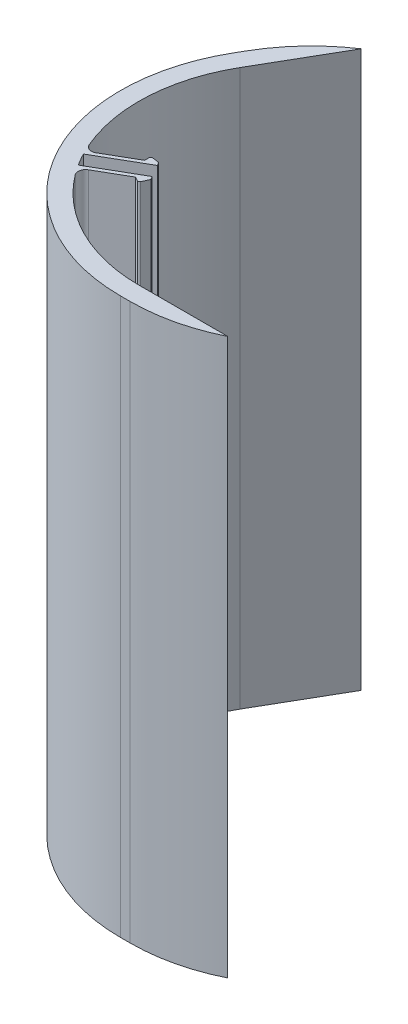
ISO-10303-21;
HEADER;
FILE_DESCRIPTION(('STEP AP214'),'2;1');
FILE_NAME('part.step','',(''),(''),'','','');
FILE_SCHEMA(('AUTOMOTIVE_DESIGN { 1 0 10303 214 1 1 1 1 }'));
ENDSEC;
DATA;
#1=APPLICATION_CONTEXT('core data for automotive mechanical design processes');
#2=APPLICATION_PROTOCOL_DEFINITION('international standard','automotive_design',2000,#1);
#3=PRODUCT_CONTEXT('',#1,'mechanical');
#4=PRODUCT('Part','Part','',(#3));
#5=PRODUCT_RELATED_PRODUCT_CATEGORY('part','',(#4));
#6=PRODUCT_DEFINITION_FORMATION('','',#4);
#7=PRODUCT_DEFINITION_CONTEXT('part definition',#1,'design');
#8=PRODUCT_DEFINITION('design','',#6,#7);
#9=PRODUCT_DEFINITION_SHAPE('','',#8);
#10=(LENGTH_UNIT() NAMED_UNIT(*) SI_UNIT(.MILLI.,.METRE.));
#11=(NAMED_UNIT(*) PLANE_ANGLE_UNIT() SI_UNIT($,.RADIAN.));
#12=(NAMED_UNIT(*) SI_UNIT($,.STERADIAN.) SOLID_ANGLE_UNIT());
#13=UNCERTAINTY_MEASURE_WITH_UNIT(LENGTH_MEASURE(1.E-05),#10,'distance_accuracy_value','');
#14=(GEOMETRIC_REPRESENTATION_CONTEXT(3) GLOBAL_UNCERTAINTY_ASSIGNED_CONTEXT((#13)) GLOBAL_UNIT_ASSIGNED_CONTEXT((#10,
#11,#12)) REPRESENTATION_CONTEXT('',''));
#15=CARTESIAN_POINT('',(0.,0.,0.));
#16=DIRECTION('',(0.,0.,1.));
#17=DIRECTION('',(1.,0.,0.));
#18=AXIS2_PLACEMENT_3D('',#15,#16,#17);
#19=CARTESIAN_POINT('',(83.1384387633066,150.,-48.));
#20=DIRECTION('',(0.,-1.,0.));
#21=DIRECTION('',(0.,0.,-1.));
#22=AXIS2_PLACEMENT_3D('',#19,#20,#21);
#23=CYLINDRICAL_SURFACE('',#22,43.);
#24=DIRECTION('',(0.,-1.,0.));
#25=VECTOR('',#24,1.);
#26=CARTESIAN_POINT('',(46.885717088677,150.,-24.8755503593741));
#27=LINE('',#26,#25);
#28=CARTESIAN_POINT('',(46.885717088677,0.,-24.875550359374));
#29=VERTEX_POINT('',#28);
#30=CARTESIAN_POINT('',(46.885717088677,150.,-24.875550359374));
#31=VERTEX_POINT('',#30);
#32=EDGE_CURVE('E230',#29,#31,#27,.F.);
#33=ORIENTED_EDGE('',*,*,#32,.F.);
#34=CARTESIAN_POINT('',(83.1384387633066,0.,-48.));
#35=DIRECTION('',(0.,-1.,0.));
#36=DIRECTION('',(0.,0.,-1.));
#37=AXIS2_PLACEMENT_3D('',#34,#35,#36);
#38=CIRCLE('',#37,43.);
#39=CARTESIAN_POINT('',(44.9857170886769,0.,-28.1664468937549));
#40=VERTEX_POINT('',#39);
#41=EDGE_CURVE('E321',#29,#40,#38,.T.);
#42=ORIENTED_EDGE('',*,*,#41,.T.);
#43=DIRECTION('',(0.,-1.,0.));
#44=VECTOR('',#43,1.);
#45=CARTESIAN_POINT('',(44.9857170886769,150.,-28.1664468937549));
#46=LINE('',#45,#44);
#47=CARTESIAN_POINT('',(44.9857170886769,150.,-28.1664468937549));
#48=VERTEX_POINT('',#47);
#49=EDGE_CURVE('E334',#48,#40,#46,.T.);
#50=ORIENTED_EDGE('',*,*,#49,.F.);
#51=CARTESIAN_POINT('',(83.1384387633066,150.,-48.));
#52=DIRECTION('',(0.,-1.,0.));
#53=DIRECTION('',(0.,0.,-1.));
#54=AXIS2_PLACEMENT_3D('',#51,#52,#53);
#55=CIRCLE('',#54,43.);
#56=EDGE_CURVE('E282',#31,#48,#55,.T.);
#57=ORIENTED_EDGE('',*,*,#56,.F.);
#58=EDGE_LOOP('',(#33,#42,#50,#57));
#59=FACE_BOUND('',#58,.T.);
#60=ADVANCED_FACE('F32',(#59),#23,.F.);
#61=CARTESIAN_POINT('',(83.1384387633084,0.,-5.00000000000001));
#62=VERTEX_POINT('',#61);
#63=CARTESIAN_POINT('',(48.7357611228602,0.,-22.2035705732841));
#64=VERTEX_POINT('',#63);
#65=EDGE_CURVE('E318',#62,#64,#38,.T.);
#66=ORIENTED_EDGE('',*,*,#65,.T.);
#67=DIRECTION('',(0.,-1.,0.));
#68=VECTOR('',#67,1.);
#69=CARTESIAN_POINT('',(48.7357611228602,150.,-22.2035705732841));
#70=LINE('',#69,#68);
#71=CARTESIAN_POINT('',(48.7357611228602,150.,-22.2035705732841));
#72=VERTEX_POINT('',#71);
#73=EDGE_CURVE('E338',#64,#72,#70,.F.);
#74=ORIENTED_EDGE('',*,*,#73,.T.);
#75=CARTESIAN_POINT('',(83.1384387633066,150.,-5.00000000000001));
#76=VERTEX_POINT('',#75);
#77=EDGE_CURVE('E278',#76,#72,#55,.T.);
#78=ORIENTED_EDGE('',*,*,#77,.F.);
#79=DIRECTION('',(0.,-1.,0.));
#80=VECTOR('',#79,1.);
#81=CARTESIAN_POINT('',(83.1384387633066,150.,-5.00000000000001));
#82=LINE('',#81,#80);
#83=EDGE_CURVE('E284',#76,#62,#82,.T.);
#84=ORIENTED_EDGE('',*,*,#83,.T.);
#85=EDGE_LOOP('',(#66,#74,#78,#84));
#86=FACE_BOUND('',#85,.T.);
#87=ADVANCED_FACE('F388',(#86),#23,.F.);
#88=CARTESIAN_POINT('',(43.596736732616,150.,-31.1046219185221));
#89=VERTEX_POINT('',#88);
#90=CARTESIAN_POINT('',(45.8993464005758,150.,-69.5000000000002));
#91=VERTEX_POINT('',#90);
#92=EDGE_CURVE('E277',#89,#91,#55,.T.);
#93=ORIENTED_EDGE('',*,*,#92,.F.);
#94=DIRECTION('',(0.,-1.,0.));
#95=VECTOR('',#94,1.);
#96=CARTESIAN_POINT('',(43.596736732616,150.,-31.1046219185221));
#97=LINE('',#96,#95);
#98=CARTESIAN_POINT('',(43.596736732616,0.,-31.1046219185221));
#99=VERTEX_POINT('',#98);
#100=EDGE_CURVE('E343',#89,#99,#97,.T.);
#101=ORIENTED_EDGE('',*,*,#100,.T.);
#102=CARTESIAN_POINT('',(45.8993464005757,0.,-69.5));
#103=VERTEX_POINT('',#102);
#104=EDGE_CURVE('E313',#99,#103,#38,.T.);
#105=ORIENTED_EDGE('',*,*,#104,.T.);
#106=DIRECTION('',(0.,-1.,0.));
#107=VECTOR('',#106,1.);
#108=CARTESIAN_POINT('',(45.8993464005758,150.,-69.5000000000002));
#109=LINE('',#108,#107);
#110=EDGE_CURVE('E287',#91,#103,#109,.T.);
#111=ORIENTED_EDGE('',*,*,#110,.F.);
#112=EDGE_LOOP('',(#93,#101,#105,#111));
#113=FACE_BOUND('',#112,.T.);
#114=ADVANCED_FACE('F458',(#113),#23,.F.);
#115=CARTESIAN_POINT('',(100.000000000001,150.,0.));
#116=DIRECTION('',(0.,0.,-1.));
#117=DIRECTION('',(-1.,0.,0.));
#118=AXIS2_PLACEMENT_3D('',#115,#116,#117);
#119=PLANE('',#118);
#120=DIRECTION('',(1.,0.,0.));
#121=VECTOR('',#120,1.);
#122=CARTESIAN_POINT('',(100.000000000001,0.,0.));
#123=LINE('',#122,#121);
#124=CARTESIAN_POINT('',(83.1384387633066,0.,0.));
#125=VERTEX_POINT('',#124);
#126=CARTESIAN_POINT('',(85.7825196463474,0.,0.));
#127=VERTEX_POINT('',#126);
#128=EDGE_CURVE('E290',#125,#127,#123,.T.);
#129=ORIENTED_EDGE('',*,*,#128,.T.);
#130=DIRECTION('',(0.,1.,0.));
#131=VECTOR('',#130,1.);
#132=CARTESIAN_POINT('',(85.7825196463474,150.,0.));
#133=LINE('',#132,#131);
#134=CARTESIAN_POINT('',(85.7825196463474,150.,0.));
#135=VERTEX_POINT('',#134);
#136=EDGE_CURVE('E325',#127,#135,#133,.T.);
#137=ORIENTED_EDGE('',*,*,#136,.T.);
#138=DIRECTION('',(1.,0.,0.));
#139=VECTOR('',#138,1.);
#140=CARTESIAN_POINT('',(100.000000000001,150.,0.));
#141=LINE('',#140,#139);
#142=CARTESIAN_POINT('',(83.1384387633066,150.,0.));
#143=VERTEX_POINT('',#142);
#144=EDGE_CURVE('E291',#143,#135,#141,.T.);
#145=ORIENTED_EDGE('',*,*,#144,.F.);
#146=DIRECTION('',(0.,-1.,0.));
#147=VECTOR('',#146,1.);
#148=CARTESIAN_POINT('',(83.1384387633066,150.,0.));
#149=LINE('',#148,#147);
#150=EDGE_CURVE('E297',#143,#125,#149,.T.);
#151=ORIENTED_EDGE('',*,*,#150,.T.);
#152=EDGE_LOOP('',(#129,#137,#145,#151));
#153=FACE_BOUND('',#152,.T.);
#154=ADVANCED_FACE('F398',(#153),#119,.F.);
#155=CARTESIAN_POINT('',(0.,150.,0.));
#156=DIRECTION('',(0.866025403784436,0.,0.500000000000004));
#157=DIRECTION('',(0.500000000000004,0.,-0.866025403784436));
#158=AXIS2_PLACEMENT_3D('',#155,#156,#157);
#159=PLANE('',#158);
#160=DIRECTION('',(-0.500000000000004,0.,0.866025403784436));
#161=VECTOR('',#160,1.);
#162=CARTESIAN_POINT('',(0.,150.,0.));
#163=LINE('',#162,#161);
#164=CARTESIAN_POINT('',(42.8912598231758,150.,-74.2898412143775));
#165=VERTEX_POINT('',#164);
#166=CARTESIAN_POINT('',(41.5692193816536,150.,-72.0000000000002));
#167=VERTEX_POINT('',#166);
#168=EDGE_CURVE('E294',#165,#167,#163,.T.);
#169=ORIENTED_EDGE('',*,*,#168,.F.);
#170=DIRECTION('',(0.,-1.,0.));
#171=VECTOR('',#170,1.);
#172=CARTESIAN_POINT('',(42.8912598231759,150.,-74.2898412143775));
#173=LINE('',#172,#171);
#174=CARTESIAN_POINT('',(42.8912598231758,0.,-74.2898412143775));
#175=VERTEX_POINT('',#174);
#176=EDGE_CURVE('E331',#165,#175,#173,.T.);
#177=ORIENTED_EDGE('',*,*,#176,.T.);
#178=DIRECTION('',(-0.500000000000004,0.,0.866025403784436));
#179=VECTOR('',#178,1.);
#180=CARTESIAN_POINT('',(0.,0.,0.));
#181=LINE('',#180,#179);
#182=CARTESIAN_POINT('',(41.5692193816536,0.,-72.0000000000002));
#183=VERTEX_POINT('',#182);
#184=EDGE_CURVE('E295',#175,#183,#181,.T.);
#185=ORIENTED_EDGE('',*,*,#184,.T.);
#186=DIRECTION('',(0.,-1.,0.));
#187=VECTOR('',#186,1.);
#188=CARTESIAN_POINT('',(41.5692193816536,150.,-72.0000000000002));
#189=LINE('',#188,#187);
#190=EDGE_CURVE('E306',#183,#167,#189,.F.);
#191=ORIENTED_EDGE('',*,*,#190,.T.);
#192=EDGE_LOOP('',(#169,#177,#185,#191));
#193=FACE_BOUND('',#192,.T.);
#194=ADVANCED_FACE('F413',(#193),#159,.F.);
#195=CARTESIAN_POINT('',(0.,150.,0.));
#196=DIRECTION('',(0.,-1.,0.));
#197=DIRECTION('',(0.,0.,-1.));
#198=AXIS2_PLACEMENT_3D('',#195,#196,#197);
#199=PLANE('',#198);
#200=DIRECTION('',(0.99075416925842,0.,0.135669363148273));
#201=VECTOR('',#200,1.);
#202=CARTESIAN_POINT('',(54.7177657049727,150.,-36.6719991280879));
#203=LINE('',#202,#201);
#204=CARTESIAN_POINT('',(55.2856003865468,150.,-36.5942424332256));
#205=VERTEX_POINT('',#204);
#206=CARTESIAN_POINT('',(57.142636835569,150.,-36.3399483205189));
#207=VERTEX_POINT('',#206);
#208=EDGE_CURVE('E239',#205,#207,#203,.T.);
#209=ORIENTED_EDGE('',*,*,#208,.F.);
#210=CARTESIAN_POINT('',(55.2177657049727,150.,-36.0988653485963));
#211=DIRECTION('',(0.,-1.,0.));
#212=DIRECTION('',(0.,0.,-1.));
#213=AXIS2_PLACEMENT_3D('',#210,#211,#212);
#214=CIRCLE('',#213,0.5);
#215=CARTESIAN_POINT('',(54.7177657049727,150.,-36.0988653485964));
#216=VERTEX_POINT('',#215);
#217=EDGE_CURVE('E362',#205,#216,#214,.F.);
#218=ORIENTED_EDGE('',*,*,#217,.T.);
#219=DIRECTION('',(0.,0.,-1.));
#220=VECTOR('',#219,1.);
#221=CARTESIAN_POINT('',(54.7177657049727,150.,-36.6719991280879));
#222=LINE('',#221,#220);
#223=CARTESIAN_POINT('',(54.7177657049727,150.,-34.939948320519));
#224=VERTEX_POINT('',#223);
#225=EDGE_CURVE('E244',#224,#216,#222,.T.);
#226=ORIENTED_EDGE('',*,*,#225,.F.);
#227=DIRECTION('',(0.866025403784438,0.,-0.500000000000001));
#228=VECTOR('',#227,1.);
#229=CARTESIAN_POINT('',(54.7177657049727,150.,-34.939948320519));
#230=LINE('',#229,#228);
#231=CARTESIAN_POINT('',(46.4358856642761,150.,-30.1584026496266));
#232=VERTEX_POINT('',#231);
#233=EDGE_CURVE('E242',#232,#224,#230,.T.);
#234=ORIENTED_EDGE('',*,*,#233,.F.);
#235=CARTESIAN_POINT('',(45.435885664276,150.,-31.8904534571955));
#236=DIRECTION('',(0.,-1.,0.));
#237=DIRECTION('',(0.,0.,-1.));
#238=AXIS2_PLACEMENT_3D('',#235,#236,#237);
#239=CIRCLE('',#238,2.);
#240=EDGE_CURVE('E349',#232,#89,#239,.T.);
#241=ORIENTED_EDGE('',*,*,#240,.T.);
#242=ORIENTED_EDGE('',*,*,#92,.T.);
#243=DIRECTION('',(0.499999999999997,0.,-0.86602540378444));
#244=VECTOR('',#243,1.);
#245=CARTESIAN_POINT('',(45.8993464005758,150.,-69.5000000000002));
#246=LINE('',#245,#244);
#247=CARTESIAN_POINT('',(57.8867513459483,150.,-90.2627944162883));
#248=VERTEX_POINT('',#247);
#249=EDGE_CURVE('E281',#91,#248,#246,.T.);
#250=ORIENTED_EDGE('',*,*,#249,.T.);
#251=CARTESIAN_POINT('',(84.4604792048288,150.,-50.2898412143773));
#252=DIRECTION('',(0.,-1.,0.));
#253=DIRECTION('',(0.,0.,-1.));
#254=AXIS2_PLACEMENT_3D('',#251,#252,#253);
#255=CIRCLE('',#254,48.);
#256=EDGE_CURVE('E327',#248,#165,#255,.F.);
#257=ORIENTED_EDGE('',*,*,#256,.T.);
#258=ORIENTED_EDGE('',*,*,#168,.T.);
#259=CARTESIAN_POINT('',(83.1384387633066,150.,-48.));
#260=DIRECTION('',(0.,-1.,0.));
#261=DIRECTION('',(0.,0.,-1.));
#262=AXIS2_PLACEMENT_3D('',#259,#260,#261);
#263=CIRCLE('',#262,48.);
#264=EDGE_CURVE('E309',#167,#143,#263,.F.);
#265=ORIENTED_EDGE('',*,*,#264,.T.);
#266=ORIENTED_EDGE('',*,*,#144,.T.);
#267=CARTESIAN_POINT('',(85.7825196463474,150.,-48.));
#268=DIRECTION('',(0.,-1.,0.));
#269=DIRECTION('',(0.,0.,-1.));
#270=AXIS2_PLACEMENT_3D('',#267,#268,#269);
#271=CIRCLE('',#270,48.);
#272=CARTESIAN_POINT('',(107.113248654052,150.,-5.00000000000124));
#273=VERTEX_POINT('',#272);
#274=EDGE_CURVE('E329',#135,#273,#271,.F.);
#275=ORIENTED_EDGE('',*,*,#274,.T.);
#276=DIRECTION('',(-1.,0.,0.));
#277=VECTOR('',#276,1.);
#278=CARTESIAN_POINT('',(97.113248654052,150.,-5.00000000000124));
#279=LINE('',#278,#277);
#280=EDGE_CURVE('E274',#273,#76,#279,.T.);
#281=ORIENTED_EDGE('',*,*,#280,.T.);
#282=ORIENTED_EDGE('',*,*,#77,.T.);
#283=CARTESIAN_POINT('',(50.3358856642763,150.,-23.4034045001081));
#284=DIRECTION('',(0.,-1.,0.));
#285=DIRECTION('',(0.,0.,-1.));
#286=AXIS2_PLACEMENT_3D('',#283,#284,#285);
#287=CIRCLE('',#286,2.);
#288=CARTESIAN_POINT('',(49.3358856642763,150.,-25.135455307677));
#289=VERTEX_POINT('',#288);
#290=EDGE_CURVE('E347',#72,#289,#287,.T.);
#291=ORIENTED_EDGE('',*,*,#290,.T.);
#292=DIRECTION('',(-0.866025403784439,0.,0.5));
#293=VECTOR('',#292,1.);
#294=CARTESIAN_POINT('',(57.4445606242156,150.,-29.8170009785692));
#295=LINE('',#294,#293);
#296=CARTESIAN_POINT('',(57.4445606242156,150.,-29.8170009785692));
#297=VERTEX_POINT('',#296);
#298=EDGE_CURVE('E234',#297,#289,#295,.T.);
#299=ORIENTED_EDGE('',*,*,#298,.F.);
#300=DIRECTION('',(-0.866025403784459,0.,-0.499999999999965));
#301=VECTOR('',#300,1.);
#302=CARTESIAN_POINT('',(58.9445606242157,150.,-28.9509755747848));
#303=LINE('',#302,#301);
#304=CARTESIAN_POINT('',(58.4711490567838,150.,-29.2242998706791));
#305=VERTEX_POINT('',#304);
#306=EDGE_CURVE('E205',#305,#297,#303,.T.);
#307=ORIENTED_EDGE('',*,*,#306,.F.);
#308=CARTESIAN_POINT('',(58.7211490567837,150.,-29.6573125725713));
#309=DIRECTION('',(0.,-1.,0.));
#310=DIRECTION('',(0.,0.,-1.));
#311=AXIS2_PLACEMENT_3D('',#308,#309,#310);
#312=CIRCLE('',#311,0.5);
#313=CARTESIAN_POINT('',(59.1746854267677,150.,-29.446825610738));
#314=VERTEX_POINT('',#313);
#315=EDGE_CURVE('E47',#305,#314,#312,.F.);
#316=ORIENTED_EDGE('',*,*,#315,.T.);
#317=DIRECTION('',(-0.420973923666519,0.,0.907072739967868));
#318=VECTOR('',#317,1.);
#319=CARTESIAN_POINT('',(60.042636835569,150.,-31.3170009785692));
#320=LINE('',#319,#318);
#321=CARTESIAN_POINT('',(60.042636835569,150.,-31.3170009785692));
#322=VERTEX_POINT('',#321);
#323=EDGE_CURVE('E368',#322,#314,#320,.T.);
#324=ORIENTED_EDGE('',*,*,#323,.F.);
#325=DIRECTION('',(0.500000000000002,0.,0.866025403784438));
#326=VECTOR('',#325,1.);
#327=CARTESIAN_POINT('',(59.542636835569,150.,-32.1830263823536));
#328=LINE('',#327,#326);
#329=CARTESIAN_POINT('',(59.542636835569,150.,-32.1830263823536));
#330=VERTEX_POINT('',#329);
#331=EDGE_CURVE('E229',#330,#322,#328,.T.);
#332=ORIENTED_EDGE('',*,*,#331,.F.);
#333=DIRECTION('',(0.866025403784438,0.,-0.500000000000001));
#334=VECTOR('',#333,1.);
#335=CARTESIAN_POINT('',(59.542636835569,150.,-32.1830263823536));
#336=LINE('',#335,#334);
#337=EDGE_CURVE('E207',#31,#330,#336,.T.);
#338=ORIENTED_EDGE('',*,*,#337,.F.);
#339=ORIENTED_EDGE('',*,*,#56,.T.);
#340=DIRECTION('',(-0.866025403784439,0.,0.5));
#341=VECTOR('',#340,1.);
#342=CARTESIAN_POINT('',(57.642636835569,150.,-35.4739229167345));
#343=LINE('',#342,#341);
#344=CARTESIAN_POINT('',(57.642636835569,150.,-35.4739229167345));
#345=VERTEX_POINT('',#344);
#346=EDGE_CURVE('E238',#345,#48,#343,.T.);
#347=ORIENTED_EDGE('',*,*,#346,.F.);
#348=DIRECTION('',(0.500000000000002,0.,0.866025403784438));
#349=VECTOR('',#348,1.);
#350=CARTESIAN_POINT('',(57.142636835569,150.,-36.3399483205189));
#351=LINE('',#350,#349);
#352=EDGE_CURVE('E235',#207,#345,#351,.T.);
#353=ORIENTED_EDGE('',*,*,#352,.F.);
#354=EDGE_LOOP('',(#209,#218,#226,#234,#241,#242,#250,#257,#258,#265,#266,#275,#281,#282,#291,
#299,#307,#316,#324,#332,#338,#339,#347,#353));
#355=FACE_BOUND('',#354,.T.);
#356=ADVANCED_FACE('F404',(#355),#199,.F.);
#357=CARTESIAN_POINT('',(0.,0.,0.));
#358=DIRECTION('',(0.,-1.,0.));
#359=DIRECTION('',(0.,0.,-1.));
#360=AXIS2_PLACEMENT_3D('',#357,#358,#359);
#361=PLANE('',#360);
#362=DIRECTION('',(0.,0.,1.));
#363=VECTOR('',#362,1.);
#364=CARTESIAN_POINT('',(54.7177657049727,0.,-36.6719991280879));
#365=LINE('',#364,#363);
#366=CARTESIAN_POINT('',(54.7177657049727,0.,-36.0988653485964));
#367=VERTEX_POINT('',#366);
#368=CARTESIAN_POINT('',(54.7177657049727,0.,-34.939948320519));
#369=VERTEX_POINT('',#368);
#370=EDGE_CURVE('E233',#367,#369,#365,.T.);
#371=ORIENTED_EDGE('',*,*,#370,.F.);
#372=CARTESIAN_POINT('',(55.2177657049727,0.,-36.0988653485963));
#373=DIRECTION('',(0.,-1.,0.));
#374=DIRECTION('',(0.,0.,-1.));
#375=AXIS2_PLACEMENT_3D('',#372,#373,#374);
#376=CIRCLE('',#375,0.5);
#377=CARTESIAN_POINT('',(55.2856003865468,0.,-36.5942424332256));
#378=VERTEX_POINT('',#377);
#379=EDGE_CURVE('E357',#367,#378,#376,.T.);
#380=ORIENTED_EDGE('',*,*,#379,.T.);
#381=DIRECTION('',(-0.99075416925842,0.,-0.135669363148273));
#382=VECTOR('',#381,1.);
#383=CARTESIAN_POINT('',(54.7177657049727,0.,-36.6719991280879));
#384=LINE('',#383,#382);
#385=CARTESIAN_POINT('',(57.142636835569,0.,-36.3399483205189));
#386=VERTEX_POINT('',#385);
#387=EDGE_CURVE('E257',#386,#378,#384,.T.);
#388=ORIENTED_EDGE('',*,*,#387,.F.);
#389=DIRECTION('',(-0.500000000000002,0.,-0.866025403784438));
#390=VECTOR('',#389,1.);
#391=CARTESIAN_POINT('',(57.142636835569,0.,-36.3399483205189));
#392=LINE('',#391,#390);
#393=CARTESIAN_POINT('',(57.642636835569,0.,-35.4739229167345));
#394=VERTEX_POINT('',#393);
#395=EDGE_CURVE('E254',#394,#386,#392,.T.);
#396=ORIENTED_EDGE('',*,*,#395,.F.);
#397=DIRECTION('',(0.866025403784439,0.,-0.5));
#398=VECTOR('',#397,1.);
#399=CARTESIAN_POINT('',(57.642636835569,0.,-35.4739229167345));
#400=LINE('',#399,#398);
#401=EDGE_CURVE('E252',#40,#394,#400,.T.);
#402=ORIENTED_EDGE('',*,*,#401,.F.);
#403=ORIENTED_EDGE('',*,*,#41,.F.);
#404=DIRECTION('',(-0.866025403784438,0.,0.500000000000001));
#405=VECTOR('',#404,1.);
#406=CARTESIAN_POINT('',(59.542636835569,0.,-32.1830263823536));
#407=LINE('',#406,#405);
#408=CARTESIAN_POINT('',(59.542636835569,0.,-32.1830263823536));
#409=VERTEX_POINT('',#408);
#410=EDGE_CURVE('E222',#409,#29,#407,.T.);
#411=ORIENTED_EDGE('',*,*,#410,.F.);
#412=DIRECTION('',(-0.500000000000002,0.,-0.866025403784438));
#413=VECTOR('',#412,1.);
#414=CARTESIAN_POINT('',(59.542636835569,0.,-32.1830263823536));
#415=LINE('',#414,#413);
#416=CARTESIAN_POINT('',(60.042636835569,0.,-31.3170009785692));
#417=VERTEX_POINT('',#416);
#418=EDGE_CURVE('E216',#417,#409,#415,.T.);
#419=ORIENTED_EDGE('',*,*,#418,.F.);
#420=DIRECTION('',(0.420973923666519,0.,-0.907072739967868));
#421=VECTOR('',#420,1.);
#422=CARTESIAN_POINT('',(60.042636835569,0.,-31.3170009785692));
#423=LINE('',#422,#421);
#424=CARTESIAN_POINT('',(59.1746854267677,0.,-29.446825610738));
#425=VERTEX_POINT('',#424);
#426=EDGE_CURVE('E214',#425,#417,#423,.T.);
#427=ORIENTED_EDGE('',*,*,#426,.F.);
#428=CARTESIAN_POINT('',(58.7211490567837,0.,-29.6573125725713));
#429=DIRECTION('',(0.,-1.,0.));
#430=DIRECTION('',(0.,0.,-1.));
#431=AXIS2_PLACEMENT_3D('',#428,#429,#430);
#432=CIRCLE('',#431,0.5);
#433=CARTESIAN_POINT('',(58.4711490567838,0.,-29.2242998706791));
#434=VERTEX_POINT('',#433);
#435=EDGE_CURVE('E213',#425,#434,#432,.T.);
#436=ORIENTED_EDGE('',*,*,#435,.T.);
#437=DIRECTION('',(0.866025403784459,0.,0.499999999999965));
#438=VECTOR('',#437,1.);
#439=CARTESIAN_POINT('',(58.9445606242157,0.,-28.9509755747848));
#440=LINE('',#439,#438);
#441=CARTESIAN_POINT('',(57.4445606242156,0.,-29.8170009785692));
#442=VERTEX_POINT('',#441);
#443=EDGE_CURVE('E202',#442,#434,#440,.T.);
#444=ORIENTED_EDGE('',*,*,#443,.F.);
#445=DIRECTION('',(0.866025403784439,0.,-0.5));
#446=VECTOR('',#445,1.);
#447=CARTESIAN_POINT('',(57.4445606242156,0.,-29.8170009785692));
#448=LINE('',#447,#446);
#449=CARTESIAN_POINT('',(49.3358856642763,0.,-25.135455307677));
#450=VERTEX_POINT('',#449);
#451=EDGE_CURVE('E193',#450,#442,#448,.T.);
#452=ORIENTED_EDGE('',*,*,#451,.F.);
#453=CARTESIAN_POINT('',(50.3358856642763,0.,-23.4034045001081));
#454=DIRECTION('',(0.,-1.,0.));
#455=DIRECTION('',(0.,0.,-1.));
#456=AXIS2_PLACEMENT_3D('',#453,#454,#455);
#457=CIRCLE('',#456,2.);
#458=EDGE_CURVE('E345',#450,#64,#457,.F.);
#459=ORIENTED_EDGE('',*,*,#458,.T.);
#460=ORIENTED_EDGE('',*,*,#65,.F.);
#461=DIRECTION('',(-1.,0.,0.));
#462=VECTOR('',#461,1.);
#463=CARTESIAN_POINT('',(-4.38186559821787E-13,0.,-4.99999999999273));
#464=LINE('',#463,#462);
#465=CARTESIAN_POINT('',(107.113248654052,0.,-5.00000000000124));
#466=VERTEX_POINT('',#465);
#467=EDGE_CURVE('E311',#466,#62,#464,.T.);
#468=ORIENTED_EDGE('',*,*,#467,.F.);
#469=CARTESIAN_POINT('',(85.7825196463474,0.,-48.));
#470=DIRECTION('',(0.,-1.,0.));
#471=DIRECTION('',(0.,0.,-1.));
#472=AXIS2_PLACEMENT_3D('',#469,#470,#471);
#473=CIRCLE('',#472,48.);
#474=EDGE_CURVE('E323',#466,#127,#473,.T.);
#475=ORIENTED_EDGE('',*,*,#474,.T.);
#476=ORIENTED_EDGE('',*,*,#128,.F.);
#477=CARTESIAN_POINT('',(83.1384387633066,0.,-48.));
#478=DIRECTION('',(0.,-1.,0.));
#479=DIRECTION('',(0.,0.,-1.));
#480=AXIS2_PLACEMENT_3D('',#477,#478,#479);
#481=CIRCLE('',#480,48.);
#482=EDGE_CURVE('E303',#125,#183,#481,.T.);
#483=ORIENTED_EDGE('',*,*,#482,.T.);
#484=ORIENTED_EDGE('',*,*,#184,.F.);
#485=CARTESIAN_POINT('',(84.4604792048288,0.,-50.2898412143773));
#486=DIRECTION('',(0.,-1.,0.));
#487=DIRECTION('',(0.,0.,-1.));
#488=AXIS2_PLACEMENT_3D('',#485,#486,#487);
#489=CIRCLE('',#488,48.);
#490=CARTESIAN_POINT('',(57.8867513459483,0.,-90.2627944162883));
#491=VERTEX_POINT('',#490);
#492=EDGE_CURVE('E317',#175,#491,#489,.T.);
#493=ORIENTED_EDGE('',*,*,#492,.T.);
#494=DIRECTION('',(0.499999999999998,0.,-0.86602540378444));
#495=VECTOR('',#494,1.);
#496=CARTESIAN_POINT('',(4.33012701892273,0.,2.50000000000029));
#497=LINE('',#496,#495);
#498=EDGE_CURVE('E314',#103,#491,#497,.T.);
#499=ORIENTED_EDGE('',*,*,#498,.F.);
#500=ORIENTED_EDGE('',*,*,#104,.F.);
#501=CARTESIAN_POINT('',(45.435885664276,0.,-31.8904534571955));
#502=DIRECTION('',(0.,-1.,0.));
#503=DIRECTION('',(0.,0.,-1.));
#504=AXIS2_PLACEMENT_3D('',#501,#502,#503);
#505=CIRCLE('',#504,2.);
#506=CARTESIAN_POINT('',(46.4358856642761,0.,-30.1584026496266));
#507=VERTEX_POINT('',#506);
#508=EDGE_CURVE('E351',#99,#507,#505,.F.);
#509=ORIENTED_EDGE('',*,*,#508,.T.);
#510=DIRECTION('',(-0.866025403784438,0.,0.500000000000001));
#511=VECTOR('',#510,1.);
#512=CARTESIAN_POINT('',(54.7177657049727,0.,-34.939948320519));
#513=LINE('',#512,#511);
#514=EDGE_CURVE('E249',#369,#507,#513,.T.);
#515=ORIENTED_EDGE('',*,*,#514,.F.);
#516=EDGE_LOOP('',(#371,#380,#388,#396,#402,#403,#411,#419,#427,#436,#444,#452,#459,#460,#468,
#475,#476,#483,#484,#493,#499,#500,#509,#515));
#517=FACE_BOUND('',#516,.T.);
#518=ADVANCED_FACE('F211',(#517),#361,.T.);
#519=CARTESIAN_POINT('',(83.1384387633066,150.,-48.));
#520=DIRECTION('',(0.,-1.,0.));
#521=DIRECTION('',(0.,0.,-1.));
#522=AXIS2_PLACEMENT_3D('',#519,#520,#521);
#523=CYLINDRICAL_SURFACE('',#522,48.);
#524=ORIENTED_EDGE('',*,*,#264,.F.);
#525=ORIENTED_EDGE('',*,*,#190,.F.);
#526=ORIENTED_EDGE('',*,*,#482,.F.);
#527=ORIENTED_EDGE('',*,*,#150,.F.);
#528=EDGE_LOOP('',(#524,#525,#526,#527));
#529=FACE_BOUND('',#528,.T.);
#530=ADVANCED_FACE('F407',(#529),#523,.T.);
#531=CARTESIAN_POINT('',(45.8993464005758,150.,-69.5000000000002));
#532=DIRECTION('',(-0.86602540378444,0.,-0.499999999999997));
#533=DIRECTION('',(-0.499999999999998,0.,0.86602540378444));
#534=AXIS2_PLACEMENT_3D('',#531,#532,#533);
#535=PLANE('',#534);
#536=ORIENTED_EDGE('',*,*,#498,.T.);
#537=DIRECTION('',(0.,-1.,0.));
#538=VECTOR('',#537,1.);
#539=CARTESIAN_POINT('',(57.8867513459483,161.713276518243,-90.2627944162883));
#540=LINE('',#539,#538);
#541=EDGE_CURVE('E271',#248,#491,#540,.T.);
#542=ORIENTED_EDGE('',*,*,#541,.F.);
#543=ORIENTED_EDGE('',*,*,#249,.F.);
#544=ORIENTED_EDGE('',*,*,#110,.T.);
#545=EDGE_LOOP('',(#536,#542,#543,#544));
#546=FACE_BOUND('',#545,.T.);
#547=ADVANCED_FACE('F421',(#546),#535,.F.);
#548=CARTESIAN_POINT('',(97.113248654052,150.,-5.00000000000124));
#549=DIRECTION('',(0.,0.,1.));
#550=DIRECTION('',(1.,0.,0.));
#551=AXIS2_PLACEMENT_3D('',#548,#549,#550);
#552=PLANE('',#551);
#553=ORIENTED_EDGE('',*,*,#467,.T.);
#554=ORIENTED_EDGE('',*,*,#83,.F.);
#555=ORIENTED_EDGE('',*,*,#280,.F.);
#556=DIRECTION('',(0.,-1.,0.));
#557=VECTOR('',#556,1.);
#558=CARTESIAN_POINT('',(107.113248654052,161.713276518243,-5.00000000000124));
#559=LINE('',#558,#557);
#560=EDGE_CURVE('E247',#273,#466,#559,.T.);
#561=ORIENTED_EDGE('',*,*,#560,.T.);
#562=EDGE_LOOP('',(#553,#554,#555,#561));
#563=FACE_BOUND('',#562,.T.);
#564=ADVANCED_FACE('F392',(#563),#552,.F.);
#565=CARTESIAN_POINT('',(85.7825196463474,161.713276518243,-48.));
#566=DIRECTION('',(0.,1.,0.));
#567=DIRECTION('',(0.,0.,1.));
#568=AXIS2_PLACEMENT_3D('',#565,#566,#567);
#569=CYLINDRICAL_SURFACE('',#568,48.);
#570=ORIENTED_EDGE('',*,*,#274,.F.);
#571=ORIENTED_EDGE('',*,*,#136,.F.);
#572=ORIENTED_EDGE('',*,*,#474,.F.);
#573=ORIENTED_EDGE('',*,*,#560,.F.);
#574=EDGE_LOOP('',(#570,#571,#572,#573));
#575=FACE_BOUND('',#574,.T.);
#576=ADVANCED_FACE('F402',(#575),#569,.T.);
#577=CARTESIAN_POINT('',(84.4604792048288,161.713276518243,-50.2898412143773));
#578=DIRECTION('',(0.,-1.,0.));
#579=DIRECTION('',(0.,0.,-1.));
#580=AXIS2_PLACEMENT_3D('',#577,#578,#579);
#581=CYLINDRICAL_SURFACE('',#580,48.);
#582=ORIENTED_EDGE('',*,*,#256,.F.);
#583=ORIENTED_EDGE('',*,*,#541,.T.);
#584=ORIENTED_EDGE('',*,*,#492,.F.);
#585=ORIENTED_EDGE('',*,*,#176,.F.);
#586=EDGE_LOOP('',(#582,#583,#584,#585));
#587=FACE_BOUND('',#586,.T.);
#588=ADVANCED_FACE('F417',(#587),#581,.T.);
#589=CARTESIAN_POINT('',(57.642636835569,167.108946940418,-35.4739229167345));
#590=DIRECTION('',(-0.5,0.,-0.866025403784439));
#591=DIRECTION('',(-0.866025403784439,0.,0.5));
#592=AXIS2_PLACEMENT_3D('',#589,#590,#591);
#593=PLANE('',#592);
#594=ORIENTED_EDGE('',*,*,#346,.T.);
#595=ORIENTED_EDGE('',*,*,#49,.T.);
#596=ORIENTED_EDGE('',*,*,#401,.T.);
#597=DIRECTION('',(0.,-1.,0.));
#598=VECTOR('',#597,1.);
#599=CARTESIAN_POINT('',(57.642636835569,167.108946940418,-35.4739229167345));
#600=LINE('',#599,#598);
#601=EDGE_CURVE('E262',#345,#394,#600,.T.);
#602=ORIENTED_EDGE('',*,*,#601,.F.);
#603=EDGE_LOOP('',(#594,#595,#596,#602));
#604=FACE_BOUND('',#603,.T.);
#605=ADVANCED_FACE('F475',(#604),#593,.F.);
#606=CARTESIAN_POINT('',(54.7177657049727,167.108946940418,-34.939948320519));
#607=DIRECTION('',(0.500000000000001,0.,0.866025403784438));
#608=DIRECTION('',(0.866025403784438,0.,-0.500000000000001));
#609=AXIS2_PLACEMENT_3D('',#606,#607,#608);
#610=PLANE('',#609);
#611=ORIENTED_EDGE('',*,*,#514,.T.);
#612=DIRECTION('',(0.,1.,0.));
#613=VECTOR('',#612,1.);
#614=CARTESIAN_POINT('',(46.4358856642761,150.,-30.1584026496266));
#615=LINE('',#614,#613);
#616=EDGE_CURVE('E340',#507,#232,#615,.T.);
#617=ORIENTED_EDGE('',*,*,#616,.T.);
#618=ORIENTED_EDGE('',*,*,#233,.T.);
#619=DIRECTION('',(0.,-1.,0.));
#620=VECTOR('',#619,1.);
#621=CARTESIAN_POINT('',(54.7177657049727,167.108946940418,-34.939948320519));
#622=LINE('',#621,#620);
#623=EDGE_CURVE('E265',#224,#369,#622,.T.);
#624=ORIENTED_EDGE('',*,*,#623,.T.);
#625=EDGE_LOOP('',(#611,#617,#618,#624));
#626=FACE_BOUND('',#625,.T.);
#627=ADVANCED_FACE('F433',(#626),#610,.F.);
#628=CARTESIAN_POINT('',(54.7177657049727,167.108946940418,-36.6719991280879));
#629=DIRECTION('',(-0.135669363148273,0.,0.99075416925842));
#630=DIRECTION('',(0.99075416925842,0.,0.135669363148273));
#631=AXIS2_PLACEMENT_3D('',#628,#629,#630);
#632=PLANE('',#631);
#633=ORIENTED_EDGE('',*,*,#387,.T.);
#634=DIRECTION('',(0.,-1.,0.));
#635=VECTOR('',#634,1.);
#636=CARTESIAN_POINT('',(55.2856003865468,167.108946940418,-36.5942424332256));
#637=LINE('',#636,#635);
#638=EDGE_CURVE('E359',#378,#205,#637,.F.);
#639=ORIENTED_EDGE('',*,*,#638,.T.);
#640=ORIENTED_EDGE('',*,*,#208,.T.);
#641=DIRECTION('',(0.,-1.,0.));
#642=VECTOR('',#641,1.);
#643=CARTESIAN_POINT('',(57.142636835569,167.108946940418,-36.3399483205189));
#644=LINE('',#643,#642);
#645=EDGE_CURVE('E260',#207,#386,#644,.T.);
#646=ORIENTED_EDGE('',*,*,#645,.T.);
#647=EDGE_LOOP('',(#633,#639,#640,#646));
#648=FACE_BOUND('',#647,.T.);
#649=ADVANCED_FACE('F446',(#648),#632,.F.);
#650=CARTESIAN_POINT('',(57.142636835569,167.108946940418,-36.3399483205189));
#651=DIRECTION('',(-0.866025403784438,0.,0.500000000000002));
#652=DIRECTION('',(0.500000000000002,0.,0.866025403784438));
#653=AXIS2_PLACEMENT_3D('',#650,#651,#652);
#654=PLANE('',#653);
#655=ORIENTED_EDGE('',*,*,#645,.F.);
#656=ORIENTED_EDGE('',*,*,#352,.T.);
#657=ORIENTED_EDGE('',*,*,#601,.T.);
#658=ORIENTED_EDGE('',*,*,#395,.T.);
#659=EDGE_LOOP('',(#655,#656,#657,#658));
#660=FACE_BOUND('',#659,.T.);
#661=ADVANCED_FACE('F478',(#660),#654,.F.);
#662=CARTESIAN_POINT('',(54.7177657049727,167.108946940418,-36.6719991280879));
#663=DIRECTION('',(1.,0.,0.));
#664=DIRECTION('',(0.,0.,-1.));
#665=AXIS2_PLACEMENT_3D('',#662,#663,#664);
#666=PLANE('',#665);
#667=ORIENTED_EDGE('',*,*,#225,.T.);
#668=DIRECTION('',(0.,-1.,0.));
#669=VECTOR('',#668,1.);
#670=CARTESIAN_POINT('',(54.7177657049727,167.108946940418,-36.0988653485964));
#671=LINE('',#670,#669);
#672=EDGE_CURVE('E353',#216,#367,#671,.T.);
#673=ORIENTED_EDGE('',*,*,#672,.T.);
#674=ORIENTED_EDGE('',*,*,#370,.T.);
#675=ORIENTED_EDGE('',*,*,#623,.F.);
#676=EDGE_LOOP('',(#667,#673,#674,#675));
#677=FACE_BOUND('',#676,.T.);
#678=ADVANCED_FACE('F440',(#677),#666,.F.);
#679=CARTESIAN_POINT('',(59.542636835569,167.108946940418,-32.1830263823536));
#680=DIRECTION('',(0.500000000000001,0.,0.866025403784438));
#681=DIRECTION('',(0.866025403784438,0.,-0.500000000000001));
#682=AXIS2_PLACEMENT_3D('',#679,#680,#681);
#683=PLANE('',#682);
#684=ORIENTED_EDGE('',*,*,#410,.T.);
#685=ORIENTED_EDGE('',*,*,#32,.T.);
#686=ORIENTED_EDGE('',*,*,#337,.T.);
#687=DIRECTION('',(0.,-1.,0.));
#688=VECTOR('',#687,1.);
#689=CARTESIAN_POINT('',(59.542636835569,167.108946940418,-32.1830263823536));
#690=LINE('',#689,#688);
#691=EDGE_CURVE('E224',#330,#409,#690,.T.);
#692=ORIENTED_EDGE('',*,*,#691,.T.);
#693=EDGE_LOOP('',(#684,#685,#686,#692));
#694=FACE_BOUND('',#693,.T.);
#695=ADVANCED_FACE('F485',(#694),#683,.F.);
#696=CARTESIAN_POINT('',(57.4445606242156,167.108946940418,-29.8170009785692));
#697=DIRECTION('',(-0.5,0.,-0.866025403784439));
#698=DIRECTION('',(-0.866025403784439,0.,0.5));
#699=AXIS2_PLACEMENT_3D('',#696,#697,#698);
#700=PLANE('',#699);
#701=ORIENTED_EDGE('',*,*,#298,.T.);
#702=DIRECTION('',(0.,1.,0.));
#703=VECTOR('',#702,1.);
#704=CARTESIAN_POINT('',(49.3358856642763,0.,-25.135455307677));
#705=LINE('',#704,#703);
#706=EDGE_CURVE('E199',#289,#450,#705,.F.);
#707=ORIENTED_EDGE('',*,*,#706,.T.);
#708=ORIENTED_EDGE('',*,*,#451,.T.);
#709=DIRECTION('',(0.,-1.,0.));
#710=VECTOR('',#709,1.);
#711=CARTESIAN_POINT('',(57.4445606242156,167.108946940418,-29.8170009785692));
#712=LINE('',#711,#710);
#713=EDGE_CURVE('E197',#297,#442,#712,.T.);
#714=ORIENTED_EDGE('',*,*,#713,.F.);
#715=EDGE_LOOP('',(#701,#707,#708,#714));
#716=FACE_BOUND('',#715,.T.);
#717=ADVANCED_FACE('F196',(#716),#700,.F.);
#718=CARTESIAN_POINT('',(59.542636835569,167.108946940418,-32.1830263823536));
#719=DIRECTION('',(-0.866025403784438,0.,0.500000000000002));
#720=DIRECTION('',(0.500000000000002,0.,0.866025403784438));
#721=AXIS2_PLACEMENT_3D('',#718,#719,#720);
#722=PLANE('',#721);
#723=ORIENTED_EDGE('',*,*,#691,.F.);
#724=ORIENTED_EDGE('',*,*,#331,.T.);
#725=DIRECTION('',(0.,-1.,0.));
#726=VECTOR('',#725,1.);
#727=CARTESIAN_POINT('',(60.042636835569,167.108946940418,-31.3170009785692));
#728=LINE('',#727,#726);
#729=EDGE_CURVE('E208',#322,#417,#728,.T.);
#730=ORIENTED_EDGE('',*,*,#729,.T.);
#731=ORIENTED_EDGE('',*,*,#418,.T.);
#732=EDGE_LOOP('',(#723,#724,#730,#731));
#733=FACE_BOUND('',#732,.T.);
#734=ADVANCED_FACE('F375',(#733),#722,.F.);
#735=CARTESIAN_POINT('',(60.042636835569,167.108946940418,-31.3170009785692));
#736=DIRECTION('',(-0.907072739967868,0.,-0.420973923666519));
#737=DIRECTION('',(-0.420973923666519,0.,0.907072739967868));
#738=AXIS2_PLACEMENT_3D('',#735,#736,#737);
#739=PLANE('',#738);
#740=ORIENTED_EDGE('',*,*,#323,.T.);
#741=DIRECTION('',(0.,-1.,0.));
#742=VECTOR('',#741,1.);
#743=CARTESIAN_POINT('',(59.1746854267677,167.108946940418,-29.446825610738));
#744=LINE('',#743,#742);
#745=EDGE_CURVE('E40',#314,#425,#744,.T.);
#746=ORIENTED_EDGE('',*,*,#745,.T.);
#747=ORIENTED_EDGE('',*,*,#426,.T.);
#748=ORIENTED_EDGE('',*,*,#729,.F.);
#749=EDGE_LOOP('',(#740,#746,#747,#748));
#750=FACE_BOUND('',#749,.T.);
#751=ADVANCED_FACE('F366',(#750),#739,.F.);
#752=CARTESIAN_POINT('',(58.9445606242157,167.108946940418,-28.9509755747848));
#753=DIRECTION('',(0.499999999999965,0.,-0.866025403784459));
#754=DIRECTION('',(-0.866025403784459,0.,-0.499999999999965));
#755=AXIS2_PLACEMENT_3D('',#752,#753,#754);
#756=PLANE('',#755);
#757=ORIENTED_EDGE('',*,*,#443,.T.);
#758=DIRECTION('',(0.,-1.,0.));
#759=VECTOR('',#758,1.);
#760=CARTESIAN_POINT('',(58.4711490567838,167.108946940418,-29.2242998706791));
#761=LINE('',#760,#759);
#762=EDGE_CURVE('E11',#434,#305,#761,.F.);
#763=ORIENTED_EDGE('',*,*,#762,.T.);
#764=ORIENTED_EDGE('',*,*,#306,.T.);
#765=ORIENTED_EDGE('',*,*,#713,.T.);
#766=EDGE_LOOP('',(#757,#763,#764,#765));
#767=FACE_BOUND('',#766,.T.);
#768=ADVANCED_FACE('F204',(#767),#756,.F.);
#769=CARTESIAN_POINT('',(50.3358856642763,150.,-23.4034045001081));
#770=DIRECTION('',(0.,-1.,0.));
#771=DIRECTION('',(0.,0.,-1.));
#772=AXIS2_PLACEMENT_3D('',#769,#770,#771);
#773=CYLINDRICAL_SURFACE('',#772,2.);
#774=ORIENTED_EDGE('',*,*,#290,.F.);
#775=ORIENTED_EDGE('',*,*,#73,.F.);
#776=ORIENTED_EDGE('',*,*,#458,.F.);
#777=ORIENTED_EDGE('',*,*,#706,.F.);
#778=EDGE_LOOP('',(#774,#775,#776,#777));
#779=FACE_BOUND('',#778,.T.);
#780=ADVANCED_FACE('F383',(#779),#773,.F.);
#781=CARTESIAN_POINT('',(45.435885664276,150.,-31.8904534571955));
#782=DIRECTION('',(0.,-1.,0.));
#783=DIRECTION('',(0.,0.,-1.));
#784=AXIS2_PLACEMENT_3D('',#781,#782,#783);
#785=CYLINDRICAL_SURFACE('',#784,2.);
#786=ORIENTED_EDGE('',*,*,#508,.F.);
#787=ORIENTED_EDGE('',*,*,#100,.F.);
#788=ORIENTED_EDGE('',*,*,#240,.F.);
#789=ORIENTED_EDGE('',*,*,#616,.F.);
#790=EDGE_LOOP('',(#786,#787,#788,#789));
#791=FACE_BOUND('',#790,.T.);
#792=ADVANCED_FACE('F430',(#791),#785,.F.);
#793=CARTESIAN_POINT('',(55.2177657049727,167.108946940418,-36.0988653485963));
#794=DIRECTION('',(0.,-1.,0.));
#795=DIRECTION('',(0.,0.,-1.));
#796=AXIS2_PLACEMENT_3D('',#793,#794,#795);
#797=CYLINDRICAL_SURFACE('',#796,0.5);
#798=ORIENTED_EDGE('',*,*,#217,.F.);
#799=ORIENTED_EDGE('',*,*,#638,.F.);
#800=ORIENTED_EDGE('',*,*,#379,.F.);
#801=ORIENTED_EDGE('',*,*,#672,.F.);
#802=EDGE_LOOP('',(#798,#799,#800,#801));
#803=FACE_BOUND('',#802,.T.);
#804=ADVANCED_FACE('F448',(#803),#797,.T.);
#805=CARTESIAN_POINT('',(58.7211490567837,167.108946940418,-29.6573125725713));
#806=DIRECTION('',(0.,-1.,0.));
#807=DIRECTION('',(0.,0.,-1.));
#808=AXIS2_PLACEMENT_3D('',#805,#806,#807);
#809=CYLINDRICAL_SURFACE('',#808,0.5);
#810=ORIENTED_EDGE('',*,*,#315,.F.);
#811=ORIENTED_EDGE('',*,*,#762,.F.);
#812=ORIENTED_EDGE('',*,*,#435,.F.);
#813=ORIENTED_EDGE('',*,*,#745,.F.);
#814=EDGE_LOOP('',(#810,#811,#812,#813));
#815=FACE_BOUND('',#814,.T.);
#816=ADVANCED_FACE('F34',(#815),#809,.T.);
#817=CLOSED_SHELL('',(#60,#87,#114,#154,#194,#356,#518,#530,#547,#564,#576,#588,#605,#627,#649,
#661,#678,#695,#717,#734,#751,#768,#780,#792,#804,#816));
#818=MANIFOLD_SOLID_BREP('B2',#817);
#819=ADVANCED_BREP_SHAPE_REPRESENTATION('',(#18,#818),#14);
#820=SHAPE_DEFINITION_REPRESENTATION(#9,#819);
ENDSEC;
END-ISO-10303-21;
